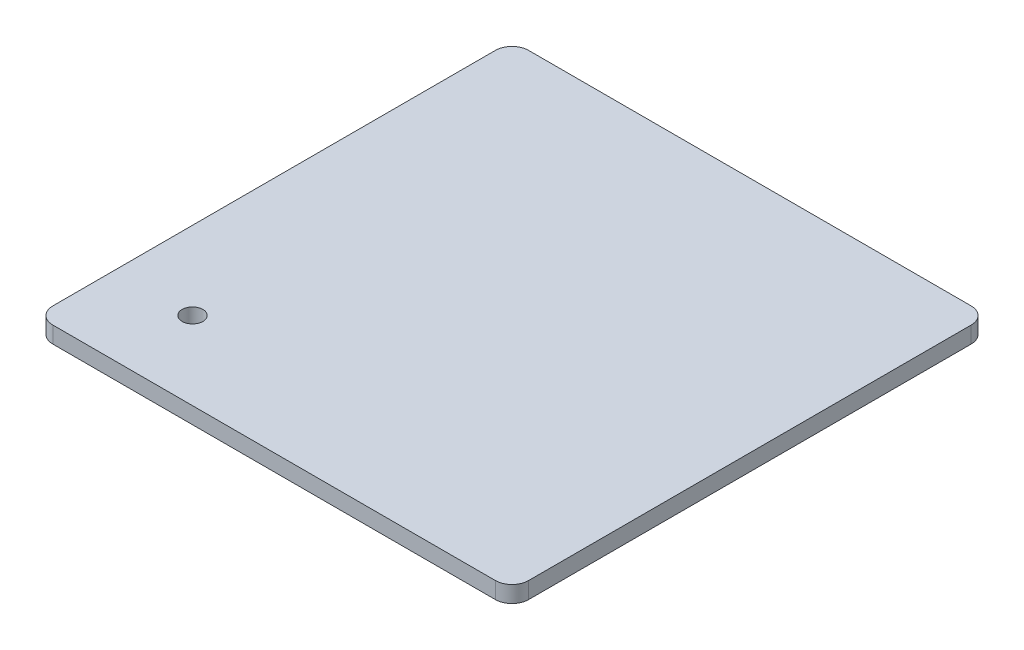
ISO-10303-21;
HEADER;
FILE_DESCRIPTION(('STEP AP214'),'2;1');
FILE_NAME('part.step','',(''),(''),'','','');
FILE_SCHEMA(('AUTOMOTIVE_DESIGN { 1 0 10303 214 1 1 1 1 }'));
ENDSEC;
DATA;
#1=APPLICATION_CONTEXT('core data for automotive mechanical design processes');
#2=APPLICATION_PROTOCOL_DEFINITION('international standard','automotive_design',2000,#1);
#3=PRODUCT_CONTEXT('',#1,'mechanical');
#4=PRODUCT('Part','Part','',(#3));
#5=PRODUCT_RELATED_PRODUCT_CATEGORY('part','',(#4));
#6=PRODUCT_DEFINITION_FORMATION('','',#4);
#7=PRODUCT_DEFINITION_CONTEXT('part definition',#1,'design');
#8=PRODUCT_DEFINITION('design','',#6,#7);
#9=PRODUCT_DEFINITION_SHAPE('','',#8);
#10=(LENGTH_UNIT() NAMED_UNIT(*) SI_UNIT(.MILLI.,.METRE.));
#11=(NAMED_UNIT(*) PLANE_ANGLE_UNIT() SI_UNIT($,.RADIAN.));
#12=(NAMED_UNIT(*) SI_UNIT($,.STERADIAN.) SOLID_ANGLE_UNIT());
#13=UNCERTAINTY_MEASURE_WITH_UNIT(LENGTH_MEASURE(1.E-05),#10,'distance_accuracy_value','');
#14=(GEOMETRIC_REPRESENTATION_CONTEXT(3) GLOBAL_UNCERTAINTY_ASSIGNED_CONTEXT((#13)) GLOBAL_UNIT_ASSIGNED_CONTEXT((#10,
#11,#12)) REPRESENTATION_CONTEXT('',''));
#15=CARTESIAN_POINT('',(0.,0.,0.));
#16=DIRECTION('',(0.,0.,1.));
#17=DIRECTION('',(1.,0.,0.));
#18=AXIS2_PLACEMENT_3D('',#15,#16,#17);
#19=CARTESIAN_POINT('',(0.,3.175,0.));
#20=DIRECTION('',(1.,0.,0.));
#21=DIRECTION('',(0.,0.,-1.));
#22=AXIS2_PLACEMENT_3D('',#19,#20,#21);
#23=PLANE('',#22);
#24=DIRECTION('',(0.,0.,1.));
#25=VECTOR('',#24,1.);
#26=CARTESIAN_POINT('',(0.,0.,0.));
#27=LINE('',#26,#25);
#28=CARTESIAN_POINT('',(0.,0.,-88.175));
#29=VERTEX_POINT('',#28);
#30=CARTESIAN_POINT('',(0.,0.,-3.175));
#31=VERTEX_POINT('',#30);
#32=EDGE_CURVE('E139',#29,#31,#27,.T.);
#33=ORIENTED_EDGE('',*,*,#32,.T.);
#34=DIRECTION('',(0.,-1.,0.));
#35=VECTOR('',#34,1.);
#36=CARTESIAN_POINT('',(0.,3.175,-3.175));
#37=LINE('',#36,#35);
#38=CARTESIAN_POINT('',(0.,3.175,-3.175));
#39=VERTEX_POINT('',#38);
#40=EDGE_CURVE('E114',#31,#39,#37,.F.);
#41=ORIENTED_EDGE('',*,*,#40,.T.);
#42=DIRECTION('',(0.,0.,1.));
#43=VECTOR('',#42,1.);
#44=CARTESIAN_POINT('',(0.,3.175,0.));
#45=LINE('',#44,#43);
#46=CARTESIAN_POINT('',(0.,3.175,-88.175));
#47=VERTEX_POINT('',#46);
#48=EDGE_CURVE('E152',#47,#39,#45,.T.);
#49=ORIENTED_EDGE('',*,*,#48,.F.);
#50=DIRECTION('',(0.,-1.,0.));
#51=VECTOR('',#50,1.);
#52=CARTESIAN_POINT('',(0.,3.175,-88.175));
#53=LINE('',#52,#51);
#54=EDGE_CURVE('E120',#47,#29,#53,.T.);
#55=ORIENTED_EDGE('',*,*,#54,.T.);
#56=EDGE_LOOP('',(#33,#41,#49,#55));
#57=FACE_BOUND('',#56,.T.);
#58=ADVANCED_FACE('F42',(#57),#23,.F.);
#59=CARTESIAN_POINT('',(0.,3.175,0.));
#60=DIRECTION('',(0.,0.,-1.));
#61=DIRECTION('',(-1.,0.,0.));
#62=AXIS2_PLACEMENT_3D('',#59,#60,#61);
#63=PLANE('',#62);
#64=DIRECTION('',(1.,0.,0.));
#65=VECTOR('',#64,1.);
#66=CARTESIAN_POINT('',(0.,3.175,0.));
#67=LINE('',#66,#65);
#68=CARTESIAN_POINT('',(3.175,3.175,0.));
#69=VERTEX_POINT('',#68);
#70=CARTESIAN_POINT('',(88.175,3.175,0.));
#71=VERTEX_POINT('',#70);
#72=EDGE_CURVE('E130',#69,#71,#67,.T.);
#73=ORIENTED_EDGE('',*,*,#72,.F.);
#74=DIRECTION('',(0.,-1.,0.));
#75=VECTOR('',#74,1.);
#76=CARTESIAN_POINT('',(3.175,3.175,0.));
#77=LINE('',#76,#75);
#78=CARTESIAN_POINT('',(3.175,0.,0.));
#79=VERTEX_POINT('',#78);
#80=EDGE_CURVE('E113',#69,#79,#77,.T.);
#81=ORIENTED_EDGE('',*,*,#80,.T.);
#82=DIRECTION('',(1.,0.,0.));
#83=VECTOR('',#82,1.);
#84=CARTESIAN_POINT('',(0.,0.,0.));
#85=LINE('',#84,#83);
#86=CARTESIAN_POINT('',(88.175,0.,0.));
#87=VERTEX_POINT('',#86);
#88=EDGE_CURVE('E127',#79,#87,#85,.T.);
#89=ORIENTED_EDGE('',*,*,#88,.T.);
#90=DIRECTION('',(0.,-1.,0.));
#91=VECTOR('',#90,1.);
#92=CARTESIAN_POINT('',(88.175,3.175,0.));
#93=LINE('',#92,#91);
#94=EDGE_CURVE('E133',#87,#71,#93,.F.);
#95=ORIENTED_EDGE('',*,*,#94,.T.);
#96=EDGE_LOOP('',(#73,#81,#89,#95));
#97=FACE_BOUND('',#96,.T.);
#98=ADVANCED_FACE('F126',(#97),#63,.F.);
#99=CARTESIAN_POINT('',(91.35,3.175,0.));
#100=DIRECTION('',(-1.,0.,0.));
#101=DIRECTION('',(0.,0.,1.));
#102=AXIS2_PLACEMENT_3D('',#99,#100,#101);
#103=PLANE('',#102);
#104=DIRECTION('',(0.,0.,-1.));
#105=VECTOR('',#104,1.);
#106=CARTESIAN_POINT('',(91.35,3.175,0.));
#107=LINE('',#106,#105);
#108=CARTESIAN_POINT('',(91.35,3.175,-3.175));
#109=VERTEX_POINT('',#108);
#110=CARTESIAN_POINT('',(91.35,3.175,-88.175));
#111=VERTEX_POINT('',#110);
#112=EDGE_CURVE('E188',#109,#111,#107,.T.);
#113=ORIENTED_EDGE('',*,*,#112,.F.);
#114=DIRECTION('',(0.,-1.,0.));
#115=VECTOR('',#114,1.);
#116=CARTESIAN_POINT('',(91.35,3.175,-3.175));
#117=LINE('',#116,#115);
#118=CARTESIAN_POINT('',(91.35,0.,-3.175));
#119=VERTEX_POINT('',#118);
#120=EDGE_CURVE('E182',#109,#119,#117,.T.);
#121=ORIENTED_EDGE('',*,*,#120,.T.);
#122=DIRECTION('',(0.,0.,-1.));
#123=VECTOR('',#122,1.);
#124=CARTESIAN_POINT('',(91.35,0.,0.));
#125=LINE('',#124,#123);
#126=CARTESIAN_POINT('',(91.35,0.,-88.175));
#127=VERTEX_POINT('',#126);
#128=EDGE_CURVE('E138',#119,#127,#125,.T.);
#129=ORIENTED_EDGE('',*,*,#128,.T.);
#130=DIRECTION('',(0.,-1.,0.));
#131=VECTOR('',#130,1.);
#132=CARTESIAN_POINT('',(91.35,3.175,-88.175));
#133=LINE('',#132,#131);
#134=EDGE_CURVE('E179',#127,#111,#133,.F.);
#135=ORIENTED_EDGE('',*,*,#134,.T.);
#136=EDGE_LOOP('',(#113,#121,#129,#135));
#137=FACE_BOUND('',#136,.T.);
#138=ADVANCED_FACE('F221',(#137),#103,.F.);
#139=CARTESIAN_POINT('',(0.,3.175,-91.35));
#140=DIRECTION('',(0.,0.,1.));
#141=DIRECTION('',(1.,0.,0.));
#142=AXIS2_PLACEMENT_3D('',#139,#140,#141);
#143=PLANE('',#142);
#144=DIRECTION('',(-1.,0.,0.));
#145=VECTOR('',#144,1.);
#146=CARTESIAN_POINT('',(0.,3.175,-91.35));
#147=LINE('',#146,#145);
#148=CARTESIAN_POINT('',(88.175,3.175,-91.35));
#149=VERTEX_POINT('',#148);
#150=CARTESIAN_POINT('',(3.175,3.175,-91.35));
#151=VERTEX_POINT('',#150);
#152=EDGE_CURVE('E154',#149,#151,#147,.T.);
#153=ORIENTED_EDGE('',*,*,#152,.F.);
#154=DIRECTION('',(0.,-1.,0.));
#155=VECTOR('',#154,1.);
#156=CARTESIAN_POINT('',(88.175,3.175,-91.35));
#157=LINE('',#156,#155);
#158=CARTESIAN_POINT('',(88.175,0.,-91.35));
#159=VERTEX_POINT('',#158);
#160=EDGE_CURVE('E11',#149,#159,#157,.T.);
#161=ORIENTED_EDGE('',*,*,#160,.T.);
#162=DIRECTION('',(-1.,0.,0.));
#163=VECTOR('',#162,1.);
#164=CARTESIAN_POINT('',(0.,0.,-91.35));
#165=LINE('',#164,#163);
#166=CARTESIAN_POINT('',(3.175,0.,-91.35));
#167=VERTEX_POINT('',#166);
#168=EDGE_CURVE('E144',#159,#167,#165,.T.);
#169=ORIENTED_EDGE('',*,*,#168,.T.);
#170=DIRECTION('',(0.,-1.,0.));
#171=VECTOR('',#170,1.);
#172=CARTESIAN_POINT('',(3.175,3.175,-91.35));
#173=LINE('',#172,#171);
#174=EDGE_CURVE('E51',#167,#151,#173,.F.);
#175=ORIENTED_EDGE('',*,*,#174,.T.);
#176=EDGE_LOOP('',(#153,#161,#169,#175));
#177=FACE_BOUND('',#176,.T.);
#178=ADVANCED_FACE('F214',(#177),#143,.F.);
#179=CARTESIAN_POINT('',(0.,3.175,0.));
#180=DIRECTION('',(0.,-1.,0.));
#181=DIRECTION('',(0.,0.,-1.));
#182=AXIS2_PLACEMENT_3D('',#179,#180,#181);
#183=PLANE('',#182);
#184=CARTESIAN_POINT('',(15.,3.175,-15.));
#185=DIRECTION('',(0.,1.,0.));
#186=DIRECTION('',(0.,0.,1.));
#187=AXIS2_PLACEMENT_3D('',#184,#185,#186);
#188=CIRCLE('',#187,2.);
#189=CARTESIAN_POINT('',(15.,3.175,-13.));
#190=VERTEX_POINT('',#189);
#191=EDGE_CURVE('E197',#190,#190,#188,.T.);
#192=ORIENTED_EDGE('',*,*,#191,.F.);
#193=EDGE_LOOP('',(#192));
#194=FACE_BOUND('',#193,.T.);
#195=ORIENTED_EDGE('',*,*,#48,.T.);
#196=CARTESIAN_POINT('',(3.175,3.175,-3.175));
#197=DIRECTION('',(0.,-1.,0.));
#198=DIRECTION('',(0.,0.,-1.));
#199=AXIS2_PLACEMENT_3D('',#196,#197,#198);
#200=CIRCLE('',#199,3.175);
#201=EDGE_CURVE('E176',#39,#69,#200,.F.);
#202=ORIENTED_EDGE('',*,*,#201,.T.);
#203=ORIENTED_EDGE('',*,*,#72,.T.);
#204=CARTESIAN_POINT('',(88.175,3.175,-3.175));
#205=DIRECTION('',(0.,-1.,0.));
#206=DIRECTION('',(0.,0.,-1.));
#207=AXIS2_PLACEMENT_3D('',#204,#205,#206);
#208=CIRCLE('',#207,3.175);
#209=EDGE_CURVE('E173',#71,#109,#208,.F.);
#210=ORIENTED_EDGE('',*,*,#209,.T.);
#211=ORIENTED_EDGE('',*,*,#112,.T.);
#212=CARTESIAN_POINT('',(88.175,3.175,-88.175));
#213=DIRECTION('',(0.,-1.,0.));
#214=DIRECTION('',(0.,0.,-1.));
#215=AXIS2_PLACEMENT_3D('',#212,#213,#214);
#216=CIRCLE('',#215,3.175);
#217=EDGE_CURVE('E64',#111,#149,#216,.F.);
#218=ORIENTED_EDGE('',*,*,#217,.T.);
#219=ORIENTED_EDGE('',*,*,#152,.T.);
#220=CARTESIAN_POINT('',(3.175,3.175,-88.175));
#221=DIRECTION('',(0.,-1.,0.));
#222=DIRECTION('',(0.,0.,-1.));
#223=AXIS2_PLACEMENT_3D('',#220,#221,#222);
#224=CIRCLE('',#223,3.175);
#225=EDGE_CURVE('E168',#151,#47,#224,.F.);
#226=ORIENTED_EDGE('',*,*,#225,.T.);
#227=EDGE_LOOP('',(#195,#202,#203,#210,#211,#218,#219,#226));
#228=FACE_BOUND('',#227,.T.);
#229=ADVANCED_FACE('F212',(#194,#228),#183,.F.);
#230=CARTESIAN_POINT('',(0.,0.,0.));
#231=DIRECTION('',(0.,-1.,0.));
#232=DIRECTION('',(0.,0.,-1.));
#233=AXIS2_PLACEMENT_3D('',#230,#231,#232);
#234=PLANE('',#233);
#235=CARTESIAN_POINT('',(15.,0.,-15.));
#236=DIRECTION('',(0.,1.,0.));
#237=DIRECTION('',(0.,0.,1.));
#238=AXIS2_PLACEMENT_3D('',#235,#236,#237);
#239=CIRCLE('',#238,2.);
#240=CARTESIAN_POINT('',(15.,0.,-13.));
#241=VERTEX_POINT('',#240);
#242=EDGE_CURVE('E146',#241,#241,#239,.T.);
#243=ORIENTED_EDGE('',*,*,#242,.T.);
#244=EDGE_LOOP('',(#243));
#245=FACE_BOUND('',#244,.T.);
#246=ORIENTED_EDGE('',*,*,#88,.F.);
#247=CARTESIAN_POINT('',(3.175,0.,-3.175));
#248=DIRECTION('',(0.,-1.,0.));
#249=DIRECTION('',(0.,0.,-1.));
#250=AXIS2_PLACEMENT_3D('',#247,#248,#249);
#251=CIRCLE('',#250,3.175);
#252=EDGE_CURVE('E109',#79,#31,#251,.T.);
#253=ORIENTED_EDGE('',*,*,#252,.T.);
#254=ORIENTED_EDGE('',*,*,#32,.F.);
#255=CARTESIAN_POINT('',(3.175,0.,-88.175));
#256=DIRECTION('',(0.,-1.,0.));
#257=DIRECTION('',(0.,0.,-1.));
#258=AXIS2_PLACEMENT_3D('',#255,#256,#257);
#259=CIRCLE('',#258,3.175);
#260=EDGE_CURVE('E132',#29,#167,#259,.T.);
#261=ORIENTED_EDGE('',*,*,#260,.T.);
#262=ORIENTED_EDGE('',*,*,#168,.F.);
#263=CARTESIAN_POINT('',(88.175,0.,-88.175));
#264=DIRECTION('',(0.,-1.,0.));
#265=DIRECTION('',(0.,0.,-1.));
#266=AXIS2_PLACEMENT_3D('',#263,#264,#265);
#267=CIRCLE('',#266,3.175);
#268=EDGE_CURVE('E158',#159,#127,#267,.T.);
#269=ORIENTED_EDGE('',*,*,#268,.T.);
#270=ORIENTED_EDGE('',*,*,#128,.F.);
#271=CARTESIAN_POINT('',(88.175,0.,-3.175));
#272=DIRECTION('',(0.,-1.,0.));
#273=DIRECTION('',(0.,0.,-1.));
#274=AXIS2_PLACEMENT_3D('',#271,#272,#273);
#275=CIRCLE('',#274,3.175);
#276=EDGE_CURVE('E121',#119,#87,#275,.T.);
#277=ORIENTED_EDGE('',*,*,#276,.T.);
#278=EDGE_LOOP('',(#246,#253,#254,#261,#262,#269,#270,#277));
#279=FACE_BOUND('',#278,.T.);
#280=ADVANCED_FACE('F135',(#245,#279),#234,.T.);
#281=CARTESIAN_POINT('',(15.,0.,-15.));
#282=DIRECTION('',(0.,1.,0.));
#283=DIRECTION('',(0.,0.,1.));
#284=AXIS2_PLACEMENT_3D('',#281,#282,#283);
#285=CYLINDRICAL_SURFACE('',#284,2.);
#286=ORIENTED_EDGE('',*,*,#242,.F.);
#287=EDGE_LOOP('',(#286));
#288=FACE_BOUND('',#287,.T.);
#289=ORIENTED_EDGE('',*,*,#191,.T.);
#290=EDGE_LOOP('',(#289));
#291=FACE_BOUND('',#290,.T.);
#292=ADVANCED_FACE('F206',(#288,#291),#285,.F.);
#293=CARTESIAN_POINT('',(3.175,3.175,-3.175));
#294=DIRECTION('',(0.,-1.,0.));
#295=DIRECTION('',(0.,0.,-1.));
#296=AXIS2_PLACEMENT_3D('',#293,#294,#295);
#297=CYLINDRICAL_SURFACE('',#296,3.175);
#298=ORIENTED_EDGE('',*,*,#201,.F.);
#299=ORIENTED_EDGE('',*,*,#40,.F.);
#300=ORIENTED_EDGE('',*,*,#252,.F.);
#301=ORIENTED_EDGE('',*,*,#80,.F.);
#302=EDGE_LOOP('',(#298,#299,#300,#301));
#303=FACE_BOUND('',#302,.T.);
#304=ADVANCED_FACE('F112',(#303),#297,.T.);
#305=CARTESIAN_POINT('',(88.175,3.175,-3.175));
#306=DIRECTION('',(0.,-1.,0.));
#307=DIRECTION('',(0.,0.,-1.));
#308=AXIS2_PLACEMENT_3D('',#305,#306,#307);
#309=CYLINDRICAL_SURFACE('',#308,3.175);
#310=ORIENTED_EDGE('',*,*,#209,.F.);
#311=ORIENTED_EDGE('',*,*,#94,.F.);
#312=ORIENTED_EDGE('',*,*,#276,.F.);
#313=ORIENTED_EDGE('',*,*,#120,.F.);
#314=EDGE_LOOP('',(#310,#311,#312,#313));
#315=FACE_BOUND('',#314,.T.);
#316=ADVANCED_FACE('F234',(#315),#309,.T.);
#317=CARTESIAN_POINT('',(88.175,3.175,-88.175));
#318=DIRECTION('',(0.,-1.,0.));
#319=DIRECTION('',(0.,0.,-1.));
#320=AXIS2_PLACEMENT_3D('',#317,#318,#319);
#321=CYLINDRICAL_SURFACE('',#320,3.175);
#322=ORIENTED_EDGE('',*,*,#217,.F.);
#323=ORIENTED_EDGE('',*,*,#134,.F.);
#324=ORIENTED_EDGE('',*,*,#268,.F.);
#325=ORIENTED_EDGE('',*,*,#160,.F.);
#326=EDGE_LOOP('',(#322,#323,#324,#325));
#327=FACE_BOUND('',#326,.T.);
#328=ADVANCED_FACE('F236',(#327),#321,.T.);
#329=CARTESIAN_POINT('',(3.175,3.175,-88.175));
#330=DIRECTION('',(0.,-1.,0.));
#331=DIRECTION('',(0.,0.,-1.));
#332=AXIS2_PLACEMENT_3D('',#329,#330,#331);
#333=CYLINDRICAL_SURFACE('',#332,3.175);
#334=ORIENTED_EDGE('',*,*,#225,.F.);
#335=ORIENTED_EDGE('',*,*,#174,.F.);
#336=ORIENTED_EDGE('',*,*,#260,.F.);
#337=ORIENTED_EDGE('',*,*,#54,.F.);
#338=EDGE_LOOP('',(#334,#335,#336,#337));
#339=FACE_BOUND('',#338,.T.);
#340=ADVANCED_FACE('F44',(#339),#333,.T.);
#341=CLOSED_SHELL('',(#58,#98,#138,#178,#229,#280,#292,#304,#316,#328,#340));
#342=MANIFOLD_SOLID_BREP('B2',#341);
#343=ADVANCED_BREP_SHAPE_REPRESENTATION('',(#18,#342),#14);
#344=SHAPE_DEFINITION_REPRESENTATION(#9,#343);
ENDSEC;
END-ISO-10303-21;
